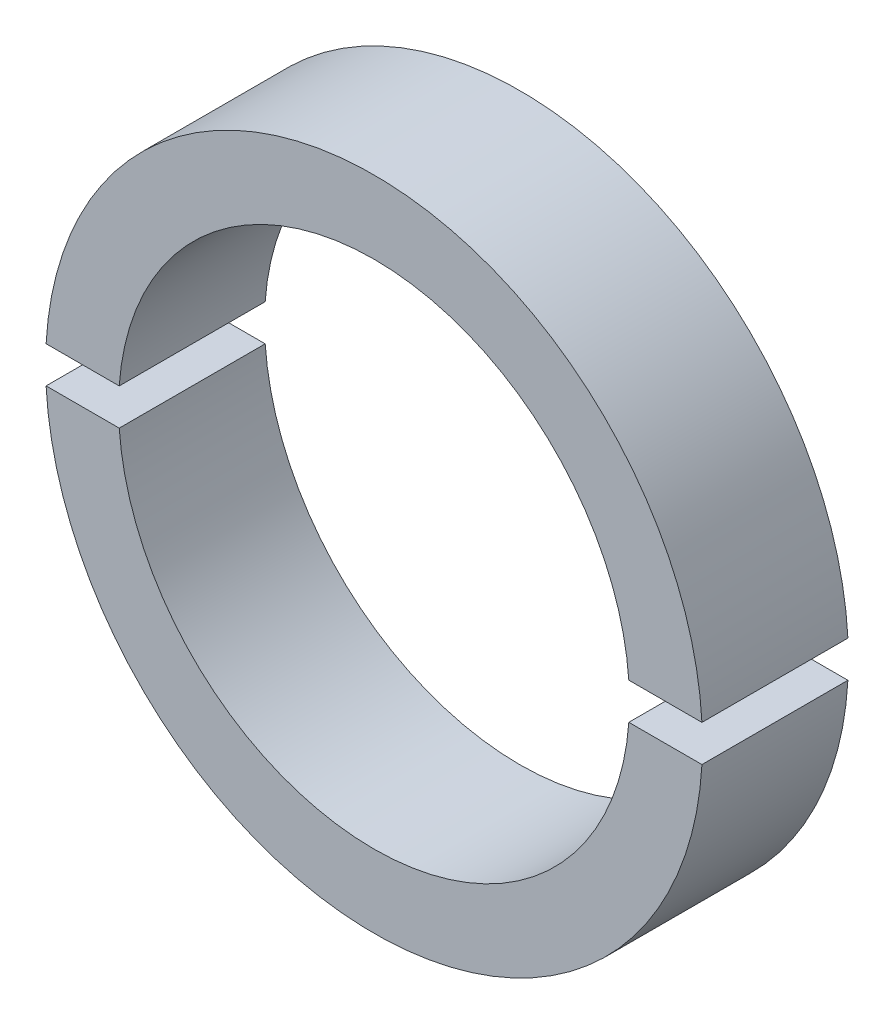
ISO-10303-21;
HEADER;
FILE_DESCRIPTION(('STEP AP214'),'2;1');
FILE_NAME('part.step','',(''),(''),'','','');
FILE_SCHEMA(('AUTOMOTIVE_DESIGN { 1 0 10303 214 1 1 1 1 }'));
ENDSEC;
DATA;
#1=APPLICATION_CONTEXT('core data for automotive mechanical design processes');
#2=APPLICATION_PROTOCOL_DEFINITION('international standard','automotive_design',2000,#1);
#3=PRODUCT_CONTEXT('',#1,'mechanical');
#4=PRODUCT('Part','Part','',(#3));
#5=PRODUCT_RELATED_PRODUCT_CATEGORY('part','',(#4));
#6=PRODUCT_DEFINITION_FORMATION('','',#4);
#7=PRODUCT_DEFINITION_CONTEXT('part definition',#1,'design');
#8=PRODUCT_DEFINITION('design','',#6,#7);
#9=PRODUCT_DEFINITION_SHAPE('','',#8);
#10=(LENGTH_UNIT() NAMED_UNIT(*) SI_UNIT(.MILLI.,.METRE.));
#11=(NAMED_UNIT(*) PLANE_ANGLE_UNIT() SI_UNIT($,.RADIAN.));
#12=(NAMED_UNIT(*) SI_UNIT($,.STERADIAN.) SOLID_ANGLE_UNIT());
#13=UNCERTAINTY_MEASURE_WITH_UNIT(LENGTH_MEASURE(1.E-05),#10,'distance_accuracy_value','');
#14=(GEOMETRIC_REPRESENTATION_CONTEXT(3) GLOBAL_UNCERTAINTY_ASSIGNED_CONTEXT((#13)) GLOBAL_UNIT_ASSIGNED_CONTEXT((#10,
#11,#12)) REPRESENTATION_CONTEXT('',''));
#15=CARTESIAN_POINT('',(0.,0.,0.));
#16=DIRECTION('',(0.,0.,1.));
#17=DIRECTION('',(1.,0.,0.));
#18=AXIS2_PLACEMENT_3D('',#15,#16,#17);
#19=CARTESIAN_POINT('',(0.,0.,4.));
#20=DIRECTION('',(0.,0.,1.));
#21=DIRECTION('',(1.,0.,0.));
#22=AXIS2_PLACEMENT_3D('',#19,#20,#21);
#23=PLANE('',#22);
#24=DIRECTION('',(1.,0.,0.));
#25=VECTOR('',#24,1.);
#26=CARTESIAN_POINT('',(-13.773418945064,-0.5,4.));
#27=LINE('',#26,#25);
#28=CARTESIAN_POINT('',(-8.98610037780571,-0.5,4.));
#29=VERTEX_POINT('',#28);
#30=CARTESIAN_POINT('',(-6.98212002188447,-0.5,4.));
#31=VERTEX_POINT('',#30);
#32=EDGE_CURVE('E50',#29,#31,#27,.T.);
#33=ORIENTED_EDGE('',*,*,#32,.F.);
#34=CARTESIAN_POINT('',(0.,0.,4.));
#35=DIRECTION('',(0.,0.,1.));
#36=DIRECTION('',(1.,0.,0.));
#37=AXIS2_PLACEMENT_3D('',#34,#35,#36);
#38=CIRCLE('',#37,9.);
#39=CARTESIAN_POINT('',(8.98610037780571,-0.5,4.));
#40=VERTEX_POINT('',#39);
#41=EDGE_CURVE('E102',#29,#40,#38,.T.);
#42=ORIENTED_EDGE('',*,*,#41,.T.);
#43=CARTESIAN_POINT('',(6.98212002188447,-0.5,4.));
#44=VERTEX_POINT('',#43);
#45=EDGE_CURVE('E99',#44,#40,#27,.T.);
#46=ORIENTED_EDGE('',*,*,#45,.F.);
#47=CARTESIAN_POINT('',(0.,0.,4.));
#48=DIRECTION('',(0.,0.,1.));
#49=DIRECTION('',(1.,0.,0.));
#50=AXIS2_PLACEMENT_3D('',#47,#48,#49);
#51=CIRCLE('',#50,7.);
#52=EDGE_CURVE('E98',#31,#44,#51,.T.);
#53=ORIENTED_EDGE('',*,*,#52,.F.);
#54=EDGE_LOOP('',(#33,#42,#46,#53));
#55=FACE_BOUND('',#54,.T.);
#56=ADVANCED_FACE('F42',(#55),#23,.T.);
#57=CARTESIAN_POINT('',(0.,0.,0.));
#58=DIRECTION('',(0.,0.,1.));
#59=DIRECTION('',(1.,0.,0.));
#60=AXIS2_PLACEMENT_3D('',#57,#58,#59);
#61=PLANE('',#60);
#62=CARTESIAN_POINT('',(0.,0.,0.));
#63=DIRECTION('',(0.,0.,1.));
#64=DIRECTION('',(1.,0.,0.));
#65=AXIS2_PLACEMENT_3D('',#62,#63,#64);
#66=CIRCLE('',#65,9.);
#67=CARTESIAN_POINT('',(-8.98610037780571,-0.5,0.));
#68=VERTEX_POINT('',#67);
#69=CARTESIAN_POINT('',(8.98610037780571,-0.5,0.));
#70=VERTEX_POINT('',#69);
#71=EDGE_CURVE('E109',#68,#70,#66,.T.);
#72=ORIENTED_EDGE('',*,*,#71,.F.);
#73=DIRECTION('',(1.,0.,0.));
#74=VECTOR('',#73,1.);
#75=CARTESIAN_POINT('',(0.,-0.5,0.));
#76=LINE('',#75,#74);
#77=CARTESIAN_POINT('',(-6.98212002188447,-0.5,0.));
#78=VERTEX_POINT('',#77);
#79=EDGE_CURVE('E63',#68,#78,#76,.T.);
#80=ORIENTED_EDGE('',*,*,#79,.T.);
#81=CARTESIAN_POINT('',(0.,0.,0.));
#82=DIRECTION('',(0.,0.,1.));
#83=DIRECTION('',(1.,0.,0.));
#84=AXIS2_PLACEMENT_3D('',#81,#82,#83);
#85=CIRCLE('',#84,7.);
#86=CARTESIAN_POINT('',(6.98212002188447,-0.5,0.));
#87=VERTEX_POINT('',#86);
#88=EDGE_CURVE('E45',#78,#87,#85,.T.);
#89=ORIENTED_EDGE('',*,*,#88,.T.);
#90=EDGE_CURVE('E83',#87,#70,#76,.T.);
#91=ORIENTED_EDGE('',*,*,#90,.T.);
#92=EDGE_LOOP('',(#72,#80,#89,#91));
#93=FACE_BOUND('',#92,.T.);
#94=ADVANCED_FACE('F101',(#93),#61,.F.);
#95=CARTESIAN_POINT('',(0.,0.,4.));
#96=DIRECTION('',(0.,0.,-1.));
#97=DIRECTION('',(-1.,0.,0.));
#98=AXIS2_PLACEMENT_3D('',#95,#96,#97);
#99=CYLINDRICAL_SURFACE('',#98,9.);
#100=ORIENTED_EDGE('',*,*,#41,.F.);
#101=DIRECTION('',(0.,0.,-1.));
#102=VECTOR('',#101,1.);
#103=CARTESIAN_POINT('',(-8.98610037780571,-0.5,4.));
#104=LINE('',#103,#102);
#105=EDGE_CURVE('E58',#29,#68,#104,.T.);
#106=ORIENTED_EDGE('',*,*,#105,.T.);
#107=ORIENTED_EDGE('',*,*,#71,.T.);
#108=DIRECTION('',(0.,0.,-1.));
#109=VECTOR('',#108,1.);
#110=CARTESIAN_POINT('',(8.98610037780571,-0.5,4.));
#111=LINE('',#110,#109);
#112=EDGE_CURVE('E86',#70,#40,#111,.F.);
#113=ORIENTED_EDGE('',*,*,#112,.T.);
#114=EDGE_LOOP('',(#100,#106,#107,#113));
#115=FACE_BOUND('',#114,.T.);
#116=ADVANCED_FACE('F112',(#115),#99,.T.);
#117=CARTESIAN_POINT('',(0.,0.,4.));
#118=DIRECTION('',(0.,0.,-1.));
#119=DIRECTION('',(-1.,0.,0.));
#120=AXIS2_PLACEMENT_3D('',#117,#118,#119);
#121=CYLINDRICAL_SURFACE('',#120,7.);
#122=DIRECTION('',(0.,0.,-1.));
#123=VECTOR('',#122,1.);
#124=CARTESIAN_POINT('',(-6.98212002188447,-0.5,4.));
#125=LINE('',#124,#123);
#126=EDGE_CURVE('E12',#31,#78,#125,.T.);
#127=ORIENTED_EDGE('',*,*,#126,.F.);
#128=ORIENTED_EDGE('',*,*,#52,.T.);
#129=DIRECTION('',(0.,0.,-1.));
#130=VECTOR('',#129,1.);
#131=CARTESIAN_POINT('',(6.98212002188447,-0.5,4.));
#132=LINE('',#131,#130);
#133=EDGE_CURVE('E80',#87,#44,#132,.F.);
#134=ORIENTED_EDGE('',*,*,#133,.F.);
#135=ORIENTED_EDGE('',*,*,#88,.F.);
#136=EDGE_LOOP('',(#127,#128,#134,#135));
#137=FACE_BOUND('',#136,.T.);
#138=ADVANCED_FACE('F96',(#137),#121,.F.);
#139=CARTESIAN_POINT('',(-13.773418945064,-0.5,-6.));
#140=DIRECTION('',(0.,-1.,0.));
#141=DIRECTION('',(0.,0.,-1.));
#142=AXIS2_PLACEMENT_3D('',#139,#140,#141);
#143=PLANE('',#142);
#144=ORIENTED_EDGE('',*,*,#90,.F.);
#145=ORIENTED_EDGE('',*,*,#133,.T.);
#146=ORIENTED_EDGE('',*,*,#45,.T.);
#147=ORIENTED_EDGE('',*,*,#112,.F.);
#148=EDGE_LOOP('',(#144,#145,#146,#147));
#149=FACE_BOUND('',#148,.T.);
#150=ADVANCED_FACE('F84',(#149),#143,.F.);
#151=ORIENTED_EDGE('',*,*,#32,.T.);
#152=ORIENTED_EDGE('',*,*,#126,.T.);
#153=ORIENTED_EDGE('',*,*,#79,.F.);
#154=ORIENTED_EDGE('',*,*,#105,.F.);
#155=EDGE_LOOP('',(#151,#152,#153,#154));
#156=FACE_BOUND('',#155,.T.);
#157=ADVANCED_FACE('F114',(#156),#143,.F.);
#158=CLOSED_SHELL('',(#56,#94,#116,#138,#150,#157));
#159=MANIFOLD_SOLID_BREP('B2',#158);
#160=CARTESIAN_POINT('',(0.,0.,4.));
#161=DIRECTION('',(0.,0.,-1.));
#162=DIRECTION('',(-1.,0.,0.));
#163=AXIS2_PLACEMENT_3D('',#160,#161,#162);
#164=CYLINDRICAL_SURFACE('',#163,7.);
#165=DIRECTION('',(0.,0.,-1.));
#166=VECTOR('',#165,1.);
#167=CARTESIAN_POINT('',(6.98212002188447,0.5,4.));
#168=LINE('',#167,#166);
#169=CARTESIAN_POINT('',(6.98212002188447,0.5,4.));
#170=VERTEX_POINT('',#169);
#171=CARTESIAN_POINT('',(6.98212002188447,0.5,0.));
#172=VERTEX_POINT('',#171);
#173=EDGE_CURVE('E40',#170,#172,#168,.T.);
#174=ORIENTED_EDGE('',*,*,#173,.F.);
#175=CARTESIAN_POINT('',(0.,0.,4.));
#176=DIRECTION('',(0.,0.,1.));
#177=DIRECTION('',(1.,0.,0.));
#178=AXIS2_PLACEMENT_3D('',#175,#176,#177);
#179=CIRCLE('',#178,7.);
#180=CARTESIAN_POINT('',(-6.98212002188447,0.5,4.));
#181=VERTEX_POINT('',#180);
#182=EDGE_CURVE('E218',#170,#181,#179,.T.);
#183=ORIENTED_EDGE('',*,*,#182,.T.);
#184=DIRECTION('',(0.,0.,-1.));
#185=VECTOR('',#184,1.);
#186=CARTESIAN_POINT('',(-6.98212002188447,0.5,4.));
#187=LINE('',#186,#185);
#188=CARTESIAN_POINT('',(-6.98212002188447,0.5,0.));
#189=VERTEX_POINT('',#188);
#190=EDGE_CURVE('E171',#189,#181,#187,.F.);
#191=ORIENTED_EDGE('',*,*,#190,.F.);
#192=CARTESIAN_POINT('',(0.,0.,0.));
#193=DIRECTION('',(0.,0.,1.));
#194=DIRECTION('',(1.,0.,0.));
#195=AXIS2_PLACEMENT_3D('',#192,#193,#194);
#196=CIRCLE('',#195,7.);
#197=EDGE_CURVE('E209',#172,#189,#196,.T.);
#198=ORIENTED_EDGE('',*,*,#197,.F.);
#199=EDGE_LOOP('',(#174,#183,#191,#198));
#200=FACE_BOUND('',#199,.T.);
#201=ADVANCED_FACE('F163',(#200),#164,.F.);
#202=CARTESIAN_POINT('',(0.,0.,4.));
#203=DIRECTION('',(0.,0.,-1.));
#204=DIRECTION('',(-1.,0.,0.));
#205=AXIS2_PLACEMENT_3D('',#202,#203,#204);
#206=CYLINDRICAL_SURFACE('',#205,9.);
#207=CARTESIAN_POINT('',(0.,0.,4.));
#208=DIRECTION('',(0.,0.,1.));
#209=DIRECTION('',(1.,0.,0.));
#210=AXIS2_PLACEMENT_3D('',#207,#208,#209);
#211=CIRCLE('',#210,9.);
#212=CARTESIAN_POINT('',(8.98610037780571,0.5,4.));
#213=VERTEX_POINT('',#212);
#214=CARTESIAN_POINT('',(-8.98610037780571,0.5,4.));
#215=VERTEX_POINT('',#214);
#216=EDGE_CURVE('E216',#213,#215,#211,.T.);
#217=ORIENTED_EDGE('',*,*,#216,.F.);
#218=DIRECTION('',(0.,0.,-1.));
#219=VECTOR('',#218,1.);
#220=CARTESIAN_POINT('',(8.98610037780571,0.5,4.));
#221=LINE('',#220,#219);
#222=CARTESIAN_POINT('',(8.98610037780571,0.5,0.));
#223=VERTEX_POINT('',#222);
#224=EDGE_CURVE('E201',#213,#223,#221,.T.);
#225=ORIENTED_EDGE('',*,*,#224,.T.);
#226=CARTESIAN_POINT('',(0.,0.,0.));
#227=DIRECTION('',(0.,0.,1.));
#228=DIRECTION('',(1.,0.,0.));
#229=AXIS2_PLACEMENT_3D('',#226,#227,#228);
#230=CIRCLE('',#229,9.);
#231=CARTESIAN_POINT('',(-8.98610037780571,0.5,0.));
#232=VERTEX_POINT('',#231);
#233=EDGE_CURVE('E223',#223,#232,#230,.T.);
#234=ORIENTED_EDGE('',*,*,#233,.T.);
#235=DIRECTION('',(0.,0.,-1.));
#236=VECTOR('',#235,1.);
#237=CARTESIAN_POINT('',(-8.98610037780571,0.5,4.));
#238=LINE('',#237,#236);
#239=EDGE_CURVE('E222',#232,#215,#238,.F.);
#240=ORIENTED_EDGE('',*,*,#239,.T.);
#241=EDGE_LOOP('',(#217,#225,#234,#240));
#242=FACE_BOUND('',#241,.T.);
#243=ADVANCED_FACE('F165',(#242),#206,.T.);
#244=CARTESIAN_POINT('',(0.,0.,0.));
#245=DIRECTION('',(0.,0.,1.));
#246=DIRECTION('',(1.,0.,0.));
#247=AXIS2_PLACEMENT_3D('',#244,#245,#246);
#248=PLANE('',#247);
#249=ORIENTED_EDGE('',*,*,#233,.F.);
#250=DIRECTION('',(-1.,0.,0.));
#251=VECTOR('',#250,1.);
#252=CARTESIAN_POINT('',(0.,0.5,0.));
#253=LINE('',#252,#251);
#254=EDGE_CURVE('E204',#223,#172,#253,.T.);
#255=ORIENTED_EDGE('',*,*,#254,.T.);
#256=ORIENTED_EDGE('',*,*,#197,.T.);
#257=EDGE_CURVE('E178',#189,#232,#253,.T.);
#258=ORIENTED_EDGE('',*,*,#257,.T.);
#259=EDGE_LOOP('',(#249,#255,#256,#258));
#260=FACE_BOUND('',#259,.T.);
#261=ADVANCED_FACE('F235',(#260),#248,.F.);
#262=CARTESIAN_POINT('',(0.,0.,4.));
#263=DIRECTION('',(0.,0.,1.));
#264=DIRECTION('',(1.,0.,0.));
#265=AXIS2_PLACEMENT_3D('',#262,#263,#264);
#266=PLANE('',#265);
#267=DIRECTION('',(-1.,0.,0.));
#268=VECTOR('',#267,1.);
#269=CARTESIAN_POINT('',(-13.773418945064,0.5,4.));
#270=LINE('',#269,#268);
#271=EDGE_CURVE('E185',#213,#170,#270,.T.);
#272=ORIENTED_EDGE('',*,*,#271,.F.);
#273=ORIENTED_EDGE('',*,*,#216,.T.);
#274=EDGE_CURVE('E219',#181,#215,#270,.T.);
#275=ORIENTED_EDGE('',*,*,#274,.F.);
#276=ORIENTED_EDGE('',*,*,#182,.F.);
#277=EDGE_LOOP('',(#272,#273,#275,#276));
#278=FACE_BOUND('',#277,.T.);
#279=ADVANCED_FACE('F214',(#278),#266,.T.);
#280=CARTESIAN_POINT('',(-13.773418945064,0.5,-6.));
#281=DIRECTION('',(0.,1.,0.));
#282=DIRECTION('',(0.,0.,1.));
#283=AXIS2_PLACEMENT_3D('',#280,#281,#282);
#284=PLANE('',#283);
#285=ORIENTED_EDGE('',*,*,#257,.F.);
#286=ORIENTED_EDGE('',*,*,#190,.T.);
#287=ORIENTED_EDGE('',*,*,#274,.T.);
#288=ORIENTED_EDGE('',*,*,#239,.F.);
#289=EDGE_LOOP('',(#285,#286,#287,#288));
#290=FACE_BOUND('',#289,.T.);
#291=ADVANCED_FACE('F231',(#290),#284,.F.);
#292=ORIENTED_EDGE('',*,*,#271,.T.);
#293=ORIENTED_EDGE('',*,*,#173,.T.);
#294=ORIENTED_EDGE('',*,*,#254,.F.);
#295=ORIENTED_EDGE('',*,*,#224,.F.);
#296=EDGE_LOOP('',(#292,#293,#294,#295));
#297=FACE_BOUND('',#296,.T.);
#298=ADVANCED_FACE('F202',(#297),#284,.F.);
#299=CLOSED_SHELL('',(#201,#243,#261,#279,#291,#298));
#300=MANIFOLD_SOLID_BREP('B6',#299);
#301=ADVANCED_BREP_SHAPE_REPRESENTATION('',(#18,#159,#300),#14);
#302=SHAPE_DEFINITION_REPRESENTATION(#9,#301);
ENDSEC;
END-ISO-10303-21;
